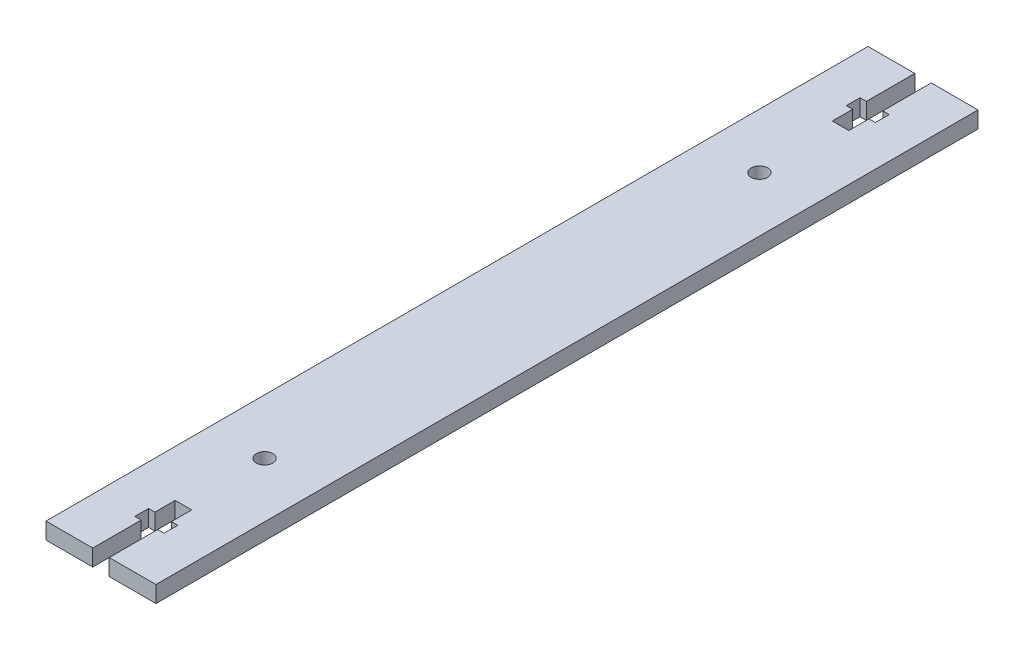
ISO-10303-21;
HEADER;
FILE_DESCRIPTION(('STEP AP214'),'2;1');
FILE_NAME('part.step','',(''),(''),'','','');
FILE_SCHEMA(('AUTOMOTIVE_DESIGN { 1 0 10303 214 1 1 1 1 }'));
ENDSEC;
DATA;
#1=APPLICATION_CONTEXT('core data for automotive mechanical design processes');
#2=APPLICATION_PROTOCOL_DEFINITION('international standard','automotive_design',2000,#1);
#3=PRODUCT_CONTEXT('',#1,'mechanical');
#4=PRODUCT('Part','Part','',(#3));
#5=PRODUCT_RELATED_PRODUCT_CATEGORY('part','',(#4));
#6=PRODUCT_DEFINITION_FORMATION('','',#4);
#7=PRODUCT_DEFINITION_CONTEXT('part definition',#1,'design');
#8=PRODUCT_DEFINITION('design','',#6,#7);
#9=PRODUCT_DEFINITION_SHAPE('','',#8);
#10=(LENGTH_UNIT() NAMED_UNIT(*) SI_UNIT(.MILLI.,.METRE.));
#11=(NAMED_UNIT(*) PLANE_ANGLE_UNIT() SI_UNIT($,.RADIAN.));
#12=(NAMED_UNIT(*) SI_UNIT($,.STERADIAN.) SOLID_ANGLE_UNIT());
#13=UNCERTAINTY_MEASURE_WITH_UNIT(LENGTH_MEASURE(1.E-05),#10,'distance_accuracy_value','');
#14=(GEOMETRIC_REPRESENTATION_CONTEXT(3) GLOBAL_UNCERTAINTY_ASSIGNED_CONTEXT((#13)) GLOBAL_UNIT_ASSIGNED_CONTEXT((#10,
#11,#12)) REPRESENTATION_CONTEXT('',''));
#15=CARTESIAN_POINT('',(0.,0.,0.));
#16=DIRECTION('',(0.,0.,1.));
#17=DIRECTION('',(1.,0.,0.));
#18=AXIS2_PLACEMENT_3D('',#15,#16,#17);
#19=CARTESIAN_POINT('',(-20.,3.,299.));
#20=DIRECTION('',(0.,-1.,0.));
#21=DIRECTION('',(0.,0.,-1.));
#22=AXIS2_PLACEMENT_3D('',#19,#20,#21);
#23=PLANE('',#22);
#24=CARTESIAN_POINT('',(0.,3.,59.5));
#25=DIRECTION('',(0.,-1.,0.));
#26=DIRECTION('',(0.,0.,-1.));
#27=AXIS2_PLACEMENT_3D('',#24,#25,#26);
#28=CIRCLE('',#27,3.);
#29=CARTESIAN_POINT('',(0.,3.,56.5));
#30=VERTEX_POINT('',#29);
#31=EDGE_CURVE('E369',#30,#30,#28,.T.);
#32=ORIENTED_EDGE('',*,*,#31,.T.);
#33=EDGE_LOOP('',(#32));
#34=FACE_BOUND('',#33,.T.);
#35=CARTESIAN_POINT('',(0.,3.,239.5));
#36=DIRECTION('',(0.,-1.,0.));
#37=DIRECTION('',(0.,0.,-1.));
#38=AXIS2_PLACEMENT_3D('',#35,#36,#37);
#39=CIRCLE('',#38,3.);
#40=CARTESIAN_POINT('',(0.,3.,236.5));
#41=VERTEX_POINT('',#40);
#42=EDGE_CURVE('E373',#41,#41,#39,.T.);
#43=ORIENTED_EDGE('',*,*,#42,.T.);
#44=EDGE_LOOP('',(#43));
#45=FACE_BOUND('',#44,.T.);
#46=DIRECTION('',(0.,0.,1.));
#47=VECTOR('',#46,1.);
#48=CARTESIAN_POINT('',(-3.00000000000004,3.,299.));
#49=LINE('',#48,#47);
#50=CARTESIAN_POINT('',(-3.,3.,0.));
#51=VERTEX_POINT('',#50);
#52=CARTESIAN_POINT('',(-3.,3.,17.6135721451776));
#53=VERTEX_POINT('',#52);
#54=EDGE_CURVE('E281',#51,#53,#49,.T.);
#55=ORIENTED_EDGE('',*,*,#54,.F.);
#56=DIRECTION('',(-1.,0.,0.));
#57=VECTOR('',#56,1.);
#58=CARTESIAN_POINT('',(-20.,3.,0.));
#59=LINE('',#58,#57);
#60=CARTESIAN_POINT('',(-20.,3.,0.));
#61=VERTEX_POINT('',#60);
#62=EDGE_CURVE('E393',#51,#61,#59,.T.);
#63=ORIENTED_EDGE('',*,*,#62,.T.);
#64=DIRECTION('',(0.,0.,-1.));
#65=VECTOR('',#64,1.);
#66=CARTESIAN_POINT('',(-20.,3.,299.));
#67=LINE('',#66,#65);
#68=CARTESIAN_POINT('',(-20.,3.,299.));
#69=VERTEX_POINT('',#68);
#70=EDGE_CURVE('E405',#69,#61,#67,.T.);
#71=ORIENTED_EDGE('',*,*,#70,.F.);
#72=DIRECTION('',(-1.,0.,0.));
#73=VECTOR('',#72,1.);
#74=CARTESIAN_POINT('',(-20.,3.,299.));
#75=LINE('',#74,#73);
#76=CARTESIAN_POINT('',(-3.,3.,299.));
#77=VERTEX_POINT('',#76);
#78=EDGE_CURVE('E380',#77,#69,#75,.T.);
#79=ORIENTED_EDGE('',*,*,#78,.F.);
#80=DIRECTION('',(0.,0.,-1.));
#81=VECTOR('',#80,1.);
#82=CARTESIAN_POINT('',(-3.,3.,299.));
#83=LINE('',#82,#81);
#84=CARTESIAN_POINT('',(-3.,3.,281.386427854822));
#85=VERTEX_POINT('',#84);
#86=EDGE_CURVE('E61',#77,#85,#83,.T.);
#87=ORIENTED_EDGE('',*,*,#86,.T.);
#88=DIRECTION('',(-1.,0.,0.));
#89=VECTOR('',#88,1.);
#90=CARTESIAN_POINT('',(-20.,3.,281.386427854822));
#91=LINE('',#90,#89);
#92=CARTESIAN_POINT('',(-5.311461505817,3.,281.386427854822));
#93=VERTEX_POINT('',#92);
#94=EDGE_CURVE('E347',#85,#93,#91,.T.);
#95=ORIENTED_EDGE('',*,*,#94,.T.);
#96=DIRECTION('',(0.,0.,-1.));
#97=VECTOR('',#96,1.);
#98=CARTESIAN_POINT('',(-5.311461505817,3.,299.));
#99=LINE('',#98,#97);
#100=CARTESIAN_POINT('',(-5.311461505817,3.,276.386427854822));
#101=VERTEX_POINT('',#100);
#102=EDGE_CURVE('E344',#93,#101,#99,.T.);
#103=ORIENTED_EDGE('',*,*,#102,.T.);
#104=DIRECTION('',(1.,0.,0.));
#105=VECTOR('',#104,1.);
#106=CARTESIAN_POINT('',(-20.,3.,276.386427854822));
#107=LINE('',#106,#105);
#108=CARTESIAN_POINT('',(-3.,3.,276.386427854822));
#109=VERTEX_POINT('',#108);
#110=EDGE_CURVE('E341',#101,#109,#107,.T.);
#111=ORIENTED_EDGE('',*,*,#110,.T.);
#112=DIRECTION('',(0.,0.,-1.));
#113=VECTOR('',#112,1.);
#114=CARTESIAN_POINT('',(-3.,3.,299.));
#115=LINE('',#114,#113);
#116=CARTESIAN_POINT('',(-3.,3.,269.));
#117=VERTEX_POINT('',#116);
#118=EDGE_CURVE('E365',#109,#117,#115,.T.);
#119=ORIENTED_EDGE('',*,*,#118,.T.);
#120=DIRECTION('',(1.,0.,0.));
#121=VECTOR('',#120,1.);
#122=CARTESIAN_POINT('',(-20.,3.,269.));
#123=LINE('',#122,#121);
#124=CARTESIAN_POINT('',(3.,3.,269.));
#125=VERTEX_POINT('',#124);
#126=EDGE_CURVE('E362',#117,#125,#123,.T.);
#127=ORIENTED_EDGE('',*,*,#126,.T.);
#128=DIRECTION('',(0.,0.,1.));
#129=VECTOR('',#128,1.);
#130=CARTESIAN_POINT('',(2.99999999999998,3.,299.));
#131=LINE('',#130,#129);
#132=CARTESIAN_POINT('',(2.99999999999999,3.,276.386427854822));
#133=VERTEX_POINT('',#132);
#134=EDGE_CURVE('E359',#125,#133,#131,.T.);
#135=ORIENTED_EDGE('',*,*,#134,.T.);
#136=DIRECTION('',(1.,0.,0.));
#137=VECTOR('',#136,1.);
#138=CARTESIAN_POINT('',(-20.,3.,276.386427854822));
#139=LINE('',#138,#137);
#140=CARTESIAN_POINT('',(5.311461505817,3.,276.386427854822));
#141=VERTEX_POINT('',#140);
#142=EDGE_CURVE('E356',#133,#141,#139,.T.);
#143=ORIENTED_EDGE('',*,*,#142,.T.);
#144=DIRECTION('',(0.,0.,1.));
#145=VECTOR('',#144,1.);
#146=CARTESIAN_POINT('',(5.311461505817,3.,299.));
#147=LINE('',#146,#145);
#148=CARTESIAN_POINT('',(5.311461505817,3.,281.386427854822));
#149=VERTEX_POINT('',#148);
#150=EDGE_CURVE('E353',#141,#149,#147,.T.);
#151=ORIENTED_EDGE('',*,*,#150,.T.);
#152=DIRECTION('',(-1.,0.,0.));
#153=VECTOR('',#152,1.);
#154=CARTESIAN_POINT('',(-20.,3.,281.386427854822));
#155=LINE('',#154,#153);
#156=CARTESIAN_POINT('',(3.,3.,281.386427854822));
#157=VERTEX_POINT('',#156);
#158=EDGE_CURVE('E350',#149,#157,#155,.T.);
#159=ORIENTED_EDGE('',*,*,#158,.T.);
#160=DIRECTION('',(0.,0.,1.));
#161=VECTOR('',#160,1.);
#162=CARTESIAN_POINT('',(3.,3.,299.));
#163=LINE('',#162,#161);
#164=CARTESIAN_POINT('',(3.,3.,299.));
#165=VERTEX_POINT('',#164);
#166=EDGE_CURVE('E338',#157,#165,#163,.T.);
#167=ORIENTED_EDGE('',*,*,#166,.T.);
#168=CARTESIAN_POINT('',(20.,3.,299.));
#169=VERTEX_POINT('',#168);
#170=EDGE_CURVE('E381',#169,#165,#75,.T.);
#171=ORIENTED_EDGE('',*,*,#170,.F.);
#172=DIRECTION('',(0.,0.,-1.));
#173=VECTOR('',#172,1.);
#174=CARTESIAN_POINT('',(20.,3.,299.));
#175=LINE('',#174,#173);
#176=CARTESIAN_POINT('',(20.,3.,0.));
#177=VERTEX_POINT('',#176);
#178=EDGE_CURVE('E408',#169,#177,#175,.T.);
#179=ORIENTED_EDGE('',*,*,#178,.T.);
#180=CARTESIAN_POINT('',(3.,3.,0.));
#181=VERTEX_POINT('',#180);
#182=EDGE_CURVE('E394',#177,#181,#59,.T.);
#183=ORIENTED_EDGE('',*,*,#182,.T.);
#184=DIRECTION('',(0.,0.,-1.));
#185=VECTOR('',#184,1.);
#186=CARTESIAN_POINT('',(3.00000000000003,3.,299.));
#187=LINE('',#186,#185);
#188=CARTESIAN_POINT('',(3.,3.,17.6135721451776));
#189=VERTEX_POINT('',#188);
#190=EDGE_CURVE('E53',#189,#181,#187,.T.);
#191=ORIENTED_EDGE('',*,*,#190,.F.);
#192=DIRECTION('',(-1.,0.,0.));
#193=VECTOR('',#192,1.);
#194=CARTESIAN_POINT('',(-20.,3.,17.6135721451776));
#195=LINE('',#194,#193);
#196=CARTESIAN_POINT('',(5.311461505817,3.,17.6135721451776));
#197=VERTEX_POINT('',#196);
#198=EDGE_CURVE('E238',#197,#189,#195,.T.);
#199=ORIENTED_EDGE('',*,*,#198,.F.);
#200=DIRECTION('',(0.,0.,-1.));
#201=VECTOR('',#200,1.);
#202=CARTESIAN_POINT('',(5.311461505817,3.,299.));
#203=LINE('',#202,#201);
#204=CARTESIAN_POINT('',(5.311461505817,3.,22.6135721451776));
#205=VERTEX_POINT('',#204);
#206=EDGE_CURVE('E292',#205,#197,#203,.T.);
#207=ORIENTED_EDGE('',*,*,#206,.F.);
#208=DIRECTION('',(1.,0.,0.));
#209=VECTOR('',#208,1.);
#210=CARTESIAN_POINT('',(-20.,3.,22.6135721451776));
#211=LINE('',#210,#209);
#212=CARTESIAN_POINT('',(2.99999999999999,3.,22.6135721451776));
#213=VERTEX_POINT('',#212);
#214=EDGE_CURVE('E290',#213,#205,#211,.T.);
#215=ORIENTED_EDGE('',*,*,#214,.F.);
#216=DIRECTION('',(0.,0.,-1.));
#217=VECTOR('',#216,1.);
#218=CARTESIAN_POINT('',(3.00000000000022,3.,299.));
#219=LINE('',#218,#217);
#220=CARTESIAN_POINT('',(3.,3.,30.));
#221=VERTEX_POINT('',#220);
#222=EDGE_CURVE('E288',#221,#213,#219,.T.);
#223=ORIENTED_EDGE('',*,*,#222,.F.);
#224=DIRECTION('',(1.,0.,0.));
#225=VECTOR('',#224,1.);
#226=CARTESIAN_POINT('',(-20.,3.,30.));
#227=LINE('',#226,#225);
#228=CARTESIAN_POINT('',(-3.,3.,30.));
#229=VERTEX_POINT('',#228);
#230=EDGE_CURVE('E283',#229,#221,#227,.T.);
#231=ORIENTED_EDGE('',*,*,#230,.F.);
#232=DIRECTION('',(0.,0.,1.));
#233=VECTOR('',#232,1.);
#234=CARTESIAN_POINT('',(-3.,3.,299.));
#235=LINE('',#234,#233);
#236=CARTESIAN_POINT('',(-3.,3.,22.6135721451776));
#237=VERTEX_POINT('',#236);
#238=EDGE_CURVE('E300',#237,#229,#235,.T.);
#239=ORIENTED_EDGE('',*,*,#238,.F.);
#240=DIRECTION('',(1.,0.,0.));
#241=VECTOR('',#240,1.);
#242=CARTESIAN_POINT('',(-20.,3.,22.6135721451776));
#243=LINE('',#242,#241);
#244=CARTESIAN_POINT('',(-5.311461505817,3.,22.6135721451776));
#245=VERTEX_POINT('',#244);
#246=EDGE_CURVE('E298',#245,#237,#243,.T.);
#247=ORIENTED_EDGE('',*,*,#246,.F.);
#248=DIRECTION('',(0.,0.,1.));
#249=VECTOR('',#248,1.);
#250=CARTESIAN_POINT('',(-5.311461505817,3.,299.));
#251=LINE('',#250,#249);
#252=CARTESIAN_POINT('',(-5.311461505817,3.,17.6135721451776));
#253=VERTEX_POINT('',#252);
#254=EDGE_CURVE('E296',#253,#245,#251,.T.);
#255=ORIENTED_EDGE('',*,*,#254,.F.);
#256=DIRECTION('',(-1.,0.,0.));
#257=VECTOR('',#256,1.);
#258=CARTESIAN_POINT('',(-20.,3.,17.6135721451776));
#259=LINE('',#258,#257);
#260=EDGE_CURVE('E272',#53,#253,#259,.T.);
#261=ORIENTED_EDGE('',*,*,#260,.F.);
#262=EDGE_LOOP('',(#55,#63,#71,#79,#87,#95,#103,#111,#119,#127,#135,#143,#151,#159,#167,#171,
#179,#183,#191,#199,#207,#215,#223,#231,#239,#247,#255,#261));
#263=FACE_BOUND('',#262,.T.);
#264=ADVANCED_FACE('F38',(#34,#45,#263),#23,.F.);
#265=CARTESIAN_POINT('',(-20.,-3.,299.));
#266=DIRECTION('',(0.,1.,0.));
#267=DIRECTION('',(0.,0.,1.));
#268=AXIS2_PLACEMENT_3D('',#265,#266,#267);
#269=PLANE('',#268);
#270=CARTESIAN_POINT('',(0.,-3.,59.5));
#271=DIRECTION('',(0.,1.,0.));
#272=DIRECTION('',(0.,0.,1.));
#273=AXIS2_PLACEMENT_3D('',#270,#271,#272);
#274=CIRCLE('',#273,3.);
#275=CARTESIAN_POINT('',(0.,-3.,62.5));
#276=VERTEX_POINT('',#275);
#277=EDGE_CURVE('E368',#276,#276,#274,.T.);
#278=ORIENTED_EDGE('',*,*,#277,.T.);
#279=EDGE_LOOP('',(#278));
#280=FACE_BOUND('',#279,.T.);
#281=CARTESIAN_POINT('',(0.,-3.,239.5));
#282=DIRECTION('',(0.,1.,0.));
#283=DIRECTION('',(0.,0.,1.));
#284=AXIS2_PLACEMENT_3D('',#281,#282,#283);
#285=CIRCLE('',#284,3.);
#286=CARTESIAN_POINT('',(0.,-3.,242.5));
#287=VERTEX_POINT('',#286);
#288=EDGE_CURVE('E372',#287,#287,#285,.T.);
#289=ORIENTED_EDGE('',*,*,#288,.T.);
#290=EDGE_LOOP('',(#289));
#291=FACE_BOUND('',#290,.T.);
#292=DIRECTION('',(0.,0.,-1.));
#293=VECTOR('',#292,1.);
#294=CARTESIAN_POINT('',(-3.00000000000004,-3.,299.));
#295=LINE('',#294,#293);
#296=CARTESIAN_POINT('',(-3.,-3.,17.6135721451776));
#297=VERTEX_POINT('',#296);
#298=CARTESIAN_POINT('',(-3.,-3.,0.));
#299=VERTEX_POINT('',#298);
#300=EDGE_CURVE('E275',#297,#299,#295,.T.);
#301=ORIENTED_EDGE('',*,*,#300,.F.);
#302=DIRECTION('',(1.,0.,0.));
#303=VECTOR('',#302,1.);
#304=CARTESIAN_POINT('',(-20.,-3.,17.6135721451776));
#305=LINE('',#304,#303);
#306=CARTESIAN_POINT('',(-5.311461505817,-3.,17.6135721451776));
#307=VERTEX_POINT('',#306);
#308=EDGE_CURVE('E11',#307,#297,#305,.T.);
#309=ORIENTED_EDGE('',*,*,#308,.F.);
#310=DIRECTION('',(0.,0.,-1.));
#311=VECTOR('',#310,1.);
#312=CARTESIAN_POINT('',(-5.311461505817,-3.,299.));
#313=LINE('',#312,#311);
#314=CARTESIAN_POINT('',(-5.311461505817,-3.,22.6135721451776));
#315=VERTEX_POINT('',#314);
#316=EDGE_CURVE('E46',#315,#307,#313,.T.);
#317=ORIENTED_EDGE('',*,*,#316,.F.);
#318=DIRECTION('',(-1.,0.,0.));
#319=VECTOR('',#318,1.);
#320=CARTESIAN_POINT('',(-20.,-3.,22.6135721451776));
#321=LINE('',#320,#319);
#322=CARTESIAN_POINT('',(-3.,-3.,22.6135721451776));
#323=VERTEX_POINT('',#322);
#324=EDGE_CURVE('E249',#323,#315,#321,.T.);
#325=ORIENTED_EDGE('',*,*,#324,.F.);
#326=DIRECTION('',(0.,0.,-1.));
#327=VECTOR('',#326,1.);
#328=CARTESIAN_POINT('',(-3.,-3.,299.));
#329=LINE('',#328,#327);
#330=CARTESIAN_POINT('',(-3.,-3.,30.));
#331=VERTEX_POINT('',#330);
#332=EDGE_CURVE('E247',#331,#323,#329,.T.);
#333=ORIENTED_EDGE('',*,*,#332,.F.);
#334=DIRECTION('',(-1.,0.,0.));
#335=VECTOR('',#334,1.);
#336=CARTESIAN_POINT('',(-20.,-3.,30.));
#337=LINE('',#336,#335);
#338=CARTESIAN_POINT('',(3.,-3.,30.));
#339=VERTEX_POINT('',#338);
#340=EDGE_CURVE('E450',#339,#331,#337,.T.);
#341=ORIENTED_EDGE('',*,*,#340,.F.);
#342=DIRECTION('',(0.,0.,1.));
#343=VECTOR('',#342,1.);
#344=CARTESIAN_POINT('',(3.00000000000022,-3.,299.));
#345=LINE('',#344,#343);
#346=CARTESIAN_POINT('',(2.99999999999999,-3.,22.6135721451776));
#347=VERTEX_POINT('',#346);
#348=EDGE_CURVE('E452',#347,#339,#345,.T.);
#349=ORIENTED_EDGE('',*,*,#348,.F.);
#350=DIRECTION('',(-1.,0.,0.));
#351=VECTOR('',#350,1.);
#352=CARTESIAN_POINT('',(-20.,-3.,22.6135721451776));
#353=LINE('',#352,#351);
#354=CARTESIAN_POINT('',(5.311461505817,-3.,22.6135721451776));
#355=VERTEX_POINT('',#354);
#356=EDGE_CURVE('E251',#355,#347,#353,.T.);
#357=ORIENTED_EDGE('',*,*,#356,.F.);
#358=DIRECTION('',(0.,0.,1.));
#359=VECTOR('',#358,1.);
#360=CARTESIAN_POINT('',(5.311461505817,-3.,299.));
#361=LINE('',#360,#359);
#362=CARTESIAN_POINT('',(5.311461505817,-3.,17.6135721451776));
#363=VERTEX_POINT('',#362);
#364=EDGE_CURVE('E246',#363,#355,#361,.T.);
#365=ORIENTED_EDGE('',*,*,#364,.F.);
#366=DIRECTION('',(1.,0.,0.));
#367=VECTOR('',#366,1.);
#368=CARTESIAN_POINT('',(-20.,-3.,17.6135721451776));
#369=LINE('',#368,#367);
#370=CARTESIAN_POINT('',(3.,-3.,17.6135721451776));
#371=VERTEX_POINT('',#370);
#372=EDGE_CURVE('E235',#371,#363,#369,.T.);
#373=ORIENTED_EDGE('',*,*,#372,.F.);
#374=DIRECTION('',(0.,0.,1.));
#375=VECTOR('',#374,1.);
#376=CARTESIAN_POINT('',(3.00000000000003,-3.,299.));
#377=LINE('',#376,#375);
#378=CARTESIAN_POINT('',(3.,-3.,0.));
#379=VERTEX_POINT('',#378);
#380=EDGE_CURVE('E222',#379,#371,#377,.T.);
#381=ORIENTED_EDGE('',*,*,#380,.F.);
#382=DIRECTION('',(1.,0.,0.));
#383=VECTOR('',#382,1.);
#384=CARTESIAN_POINT('',(-20.,-3.,0.));
#385=LINE('',#384,#383);
#386=CARTESIAN_POINT('',(20.,-3.,0.));
#387=VERTEX_POINT('',#386);
#388=EDGE_CURVE('E399',#379,#387,#385,.T.);
#389=ORIENTED_EDGE('',*,*,#388,.T.);
#390=DIRECTION('',(0.,0.,-1.));
#391=VECTOR('',#390,1.);
#392=CARTESIAN_POINT('',(20.,-3.,299.));
#393=LINE('',#392,#391);
#394=CARTESIAN_POINT('',(20.,-3.,299.));
#395=VERTEX_POINT('',#394);
#396=EDGE_CURVE('E390',#395,#387,#393,.T.);
#397=ORIENTED_EDGE('',*,*,#396,.F.);
#398=DIRECTION('',(1.,0.,0.));
#399=VECTOR('',#398,1.);
#400=CARTESIAN_POINT('',(-20.,-3.,299.));
#401=LINE('',#400,#399);
#402=CARTESIAN_POINT('',(3.,-3.,299.));
#403=VERTEX_POINT('',#402);
#404=EDGE_CURVE('E386',#403,#395,#401,.T.);
#405=ORIENTED_EDGE('',*,*,#404,.F.);
#406=DIRECTION('',(0.,0.,-1.));
#407=VECTOR('',#406,1.);
#408=CARTESIAN_POINT('',(3.,-3.,299.));
#409=LINE('',#408,#407);
#410=CARTESIAN_POINT('',(3.,-3.,281.386427854822));
#411=VERTEX_POINT('',#410);
#412=EDGE_CURVE('E335',#403,#411,#409,.T.);
#413=ORIENTED_EDGE('',*,*,#412,.T.);
#414=DIRECTION('',(1.,0.,0.));
#415=VECTOR('',#414,1.);
#416=CARTESIAN_POINT('',(-20.,-3.,281.386427854822));
#417=LINE('',#416,#415);
#418=CARTESIAN_POINT('',(5.311461505817,-3.,281.386427854822));
#419=VERTEX_POINT('',#418);
#420=EDGE_CURVE('E444',#411,#419,#417,.T.);
#421=ORIENTED_EDGE('',*,*,#420,.T.);
#422=DIRECTION('',(0.,0.,-1.));
#423=VECTOR('',#422,1.);
#424=CARTESIAN_POINT('',(5.311461505817,-3.,299.));
#425=LINE('',#424,#423);
#426=CARTESIAN_POINT('',(5.311461505817,-3.,276.386427854822));
#427=VERTEX_POINT('',#426);
#428=EDGE_CURVE('E441',#419,#427,#425,.T.);
#429=ORIENTED_EDGE('',*,*,#428,.T.);
#430=DIRECTION('',(-1.,0.,0.));
#431=VECTOR('',#430,1.);
#432=CARTESIAN_POINT('',(-20.,-3.,276.386427854822));
#433=LINE('',#432,#431);
#434=CARTESIAN_POINT('',(2.99999999999999,-3.,276.386427854822));
#435=VERTEX_POINT('',#434);
#436=EDGE_CURVE('E438',#427,#435,#433,.T.);
#437=ORIENTED_EDGE('',*,*,#436,.T.);
#438=DIRECTION('',(0.,0.,-1.));
#439=VECTOR('',#438,1.);
#440=CARTESIAN_POINT('',(2.99999999999998,-3.,299.));
#441=LINE('',#440,#439);
#442=CARTESIAN_POINT('',(3.,-3.,269.));
#443=VERTEX_POINT('',#442);
#444=EDGE_CURVE('E435',#435,#443,#441,.T.);
#445=ORIENTED_EDGE('',*,*,#444,.T.);
#446=DIRECTION('',(-1.,0.,0.));
#447=VECTOR('',#446,1.);
#448=CARTESIAN_POINT('',(-20.,-3.,269.));
#449=LINE('',#448,#447);
#450=CARTESIAN_POINT('',(-3.,-3.,269.));
#451=VERTEX_POINT('',#450);
#452=EDGE_CURVE('E432',#443,#451,#449,.T.);
#453=ORIENTED_EDGE('',*,*,#452,.T.);
#454=DIRECTION('',(0.,0.,1.));
#455=VECTOR('',#454,1.);
#456=CARTESIAN_POINT('',(-3.,-3.,299.));
#457=LINE('',#456,#455);
#458=CARTESIAN_POINT('',(-3.,-3.,276.386427854822));
#459=VERTEX_POINT('',#458);
#460=EDGE_CURVE('E429',#451,#459,#457,.T.);
#461=ORIENTED_EDGE('',*,*,#460,.T.);
#462=DIRECTION('',(-1.,0.,0.));
#463=VECTOR('',#462,1.);
#464=CARTESIAN_POINT('',(-20.,-3.,276.386427854822));
#465=LINE('',#464,#463);
#466=CARTESIAN_POINT('',(-5.311461505817,-3.,276.386427854822));
#467=VERTEX_POINT('',#466);
#468=EDGE_CURVE('E420',#459,#467,#465,.T.);
#469=ORIENTED_EDGE('',*,*,#468,.T.);
#470=DIRECTION('',(0.,0.,1.));
#471=VECTOR('',#470,1.);
#472=CARTESIAN_POINT('',(-5.311461505817,-3.,299.));
#473=LINE('',#472,#471);
#474=CARTESIAN_POINT('',(-5.311461505817,-3.,281.386427854822));
#475=VERTEX_POINT('',#474);
#476=EDGE_CURVE('E423',#467,#475,#473,.T.);
#477=ORIENTED_EDGE('',*,*,#476,.T.);
#478=DIRECTION('',(1.,0.,0.));
#479=VECTOR('',#478,1.);
#480=CARTESIAN_POINT('',(-20.,-3.,281.386427854822));
#481=LINE('',#480,#479);
#482=CARTESIAN_POINT('',(-3.,-3.,281.386427854822));
#483=VERTEX_POINT('',#482);
#484=EDGE_CURVE('E426',#475,#483,#481,.T.);
#485=ORIENTED_EDGE('',*,*,#484,.T.);
#486=DIRECTION('',(0.,0.,1.));
#487=VECTOR('',#486,1.);
#488=CARTESIAN_POINT('',(-3.,-3.,299.));
#489=LINE('',#488,#487);
#490=CARTESIAN_POINT('',(-3.,-3.,299.));
#491=VERTEX_POINT('',#490);
#492=EDGE_CURVE('E306',#483,#491,#489,.T.);
#493=ORIENTED_EDGE('',*,*,#492,.T.);
#494=CARTESIAN_POINT('',(-20.,-3.,299.));
#495=VERTEX_POINT('',#494);
#496=EDGE_CURVE('E387',#495,#491,#401,.T.);
#497=ORIENTED_EDGE('',*,*,#496,.F.);
#498=DIRECTION('',(0.,0.,-1.));
#499=VECTOR('',#498,1.);
#500=CARTESIAN_POINT('',(-20.,-3.,299.));
#501=LINE('',#500,#499);
#502=CARTESIAN_POINT('',(-20.,-3.,0.));
#503=VERTEX_POINT('',#502);
#504=EDGE_CURVE('E403',#495,#503,#501,.T.);
#505=ORIENTED_EDGE('',*,*,#504,.T.);
#506=EDGE_CURVE('E278',#503,#299,#385,.T.);
#507=ORIENTED_EDGE('',*,*,#506,.T.);
#508=EDGE_LOOP('',(#301,#309,#317,#325,#333,#341,#349,#357,#365,#373,#381,#389,#397,#405,#413,
#421,#429,#437,#445,#453,#461,#469,#477,#485,#493,#497,#505,#507));
#509=FACE_BOUND('',#508,.T.);
#510=ADVANCED_FACE('F244',(#280,#291,#509),#269,.F.);
#511=CARTESIAN_POINT('',(0.,0.,0.));
#512=DIRECTION('',(0.,0.,-1.));
#513=DIRECTION('',(-1.,0.,0.));
#514=AXIS2_PLACEMENT_3D('',#511,#512,#513);
#515=PLANE('',#514);
#516=ORIENTED_EDGE('',*,*,#62,.F.);
#517=DIRECTION('',(0.,-1.,0.));
#518=VECTOR('',#517,1.);
#519=CARTESIAN_POINT('',(-3.,0.,0.));
#520=LINE('',#519,#518);
#521=EDGE_CURVE('E448',#51,#299,#520,.T.);
#522=ORIENTED_EDGE('',*,*,#521,.T.);
#523=ORIENTED_EDGE('',*,*,#506,.F.);
#524=DIRECTION('',(0.,-1.,0.));
#525=VECTOR('',#524,1.);
#526=CARTESIAN_POINT('',(-20.,-3.,0.));
#527=LINE('',#526,#525);
#528=EDGE_CURVE('E397',#61,#503,#527,.T.);
#529=ORIENTED_EDGE('',*,*,#528,.F.);
#530=EDGE_LOOP('',(#516,#522,#523,#529));
#531=FACE_BOUND('',#530,.T.);
#532=ADVANCED_FACE('F549',(#531),#515,.T.);
#533=ORIENTED_EDGE('',*,*,#388,.F.);
#534=DIRECTION('',(0.,1.,0.));
#535=VECTOR('',#534,1.);
#536=CARTESIAN_POINT('',(3.,0.,0.));
#537=LINE('',#536,#535);
#538=EDGE_CURVE('E226',#379,#181,#537,.T.);
#539=ORIENTED_EDGE('',*,*,#538,.T.);
#540=ORIENTED_EDGE('',*,*,#182,.F.);
#541=DIRECTION('',(0.,1.,0.));
#542=VECTOR('',#541,1.);
#543=CARTESIAN_POINT('',(20.,-3.,0.));
#544=LINE('',#543,#542);
#545=EDGE_CURVE('E376',#387,#177,#544,.T.);
#546=ORIENTED_EDGE('',*,*,#545,.F.);
#547=EDGE_LOOP('',(#533,#539,#540,#546));
#548=FACE_BOUND('',#547,.T.);
#549=ADVANCED_FACE('F500',(#548),#515,.T.);
#550=CARTESIAN_POINT('',(0.,0.,299.));
#551=DIRECTION('',(0.,0.,-1.));
#552=DIRECTION('',(-1.,0.,0.));
#553=AXIS2_PLACEMENT_3D('',#550,#551,#552);
#554=PLANE('',#553);
#555=ORIENTED_EDGE('',*,*,#170,.T.);
#556=DIRECTION('',(0.,-1.,0.));
#557=VECTOR('',#556,1.);
#558=CARTESIAN_POINT('',(3.,0.,299.));
#559=LINE('',#558,#557);
#560=EDGE_CURVE('E417',#165,#403,#559,.T.);
#561=ORIENTED_EDGE('',*,*,#560,.T.);
#562=ORIENTED_EDGE('',*,*,#404,.T.);
#563=DIRECTION('',(0.,1.,0.));
#564=VECTOR('',#563,1.);
#565=CARTESIAN_POINT('',(20.,-3.,299.));
#566=LINE('',#565,#564);
#567=EDGE_CURVE('E377',#395,#169,#566,.T.);
#568=ORIENTED_EDGE('',*,*,#567,.T.);
#569=EDGE_LOOP('',(#555,#561,#562,#568));
#570=FACE_BOUND('',#569,.T.);
#571=ADVANCED_FACE('F506',(#570),#554,.F.);
#572=CARTESIAN_POINT('',(20.,-3.,299.));
#573=DIRECTION('',(-1.,0.,0.));
#574=DIRECTION('',(0.,0.,1.));
#575=AXIS2_PLACEMENT_3D('',#572,#573,#574);
#576=PLANE('',#575);
#577=ORIENTED_EDGE('',*,*,#545,.T.);
#578=ORIENTED_EDGE('',*,*,#178,.F.);
#579=ORIENTED_EDGE('',*,*,#567,.F.);
#580=ORIENTED_EDGE('',*,*,#396,.T.);
#581=EDGE_LOOP('',(#577,#578,#579,#580));
#582=FACE_BOUND('',#581,.T.);
#583=ADVANCED_FACE('F40',(#582),#576,.F.);
#584=CARTESIAN_POINT('',(-20.,-3.,299.));
#585=DIRECTION('',(1.,0.,0.));
#586=DIRECTION('',(0.,0.,-1.));
#587=AXIS2_PLACEMENT_3D('',#584,#585,#586);
#588=PLANE('',#587);
#589=ORIENTED_EDGE('',*,*,#528,.T.);
#590=ORIENTED_EDGE('',*,*,#504,.F.);
#591=DIRECTION('',(0.,-1.,0.));
#592=VECTOR('',#591,1.);
#593=CARTESIAN_POINT('',(-20.,-3.,299.));
#594=LINE('',#593,#592);
#595=EDGE_CURVE('E384',#69,#495,#594,.T.);
#596=ORIENTED_EDGE('',*,*,#595,.F.);
#597=ORIENTED_EDGE('',*,*,#70,.T.);
#598=EDGE_LOOP('',(#589,#590,#596,#597));
#599=FACE_BOUND('',#598,.T.);
#600=ADVANCED_FACE('F569',(#599),#588,.F.);
#601=ORIENTED_EDGE('',*,*,#496,.T.);
#602=DIRECTION('',(0.,1.,0.));
#603=VECTOR('',#602,1.);
#604=CARTESIAN_POINT('',(-3.,0.,299.));
#605=LINE('',#604,#603);
#606=EDGE_CURVE('E411',#491,#77,#605,.T.);
#607=ORIENTED_EDGE('',*,*,#606,.T.);
#608=ORIENTED_EDGE('',*,*,#78,.T.);
#609=ORIENTED_EDGE('',*,*,#595,.T.);
#610=EDGE_LOOP('',(#601,#607,#608,#609));
#611=FACE_BOUND('',#610,.T.);
#612=ADVANCED_FACE('F541',(#611),#554,.F.);
#613=CARTESIAN_POINT('',(0.,-39.,59.5));
#614=DIRECTION('',(0.,1.,0.));
#615=DIRECTION('',(0.,0.,1.));
#616=AXIS2_PLACEMENT_3D('',#613,#614,#615);
#617=CYLINDRICAL_SURFACE('',#616,3.);
#618=ORIENTED_EDGE('',*,*,#277,.F.);
#619=EDGE_LOOP('',(#618));
#620=FACE_BOUND('',#619,.T.);
#621=ORIENTED_EDGE('',*,*,#31,.F.);
#622=EDGE_LOOP('',(#621));
#623=FACE_BOUND('',#622,.T.);
#624=ADVANCED_FACE('F576',(#620,#623),#617,.F.);
#625=CARTESIAN_POINT('',(0.,-39.,239.5));
#626=DIRECTION('',(0.,1.,0.));
#627=DIRECTION('',(0.,0.,1.));
#628=AXIS2_PLACEMENT_3D('',#625,#626,#627);
#629=CYLINDRICAL_SURFACE('',#628,3.);
#630=ORIENTED_EDGE('',*,*,#288,.F.);
#631=EDGE_LOOP('',(#630));
#632=FACE_BOUND('',#631,.T.);
#633=ORIENTED_EDGE('',*,*,#42,.F.);
#634=EDGE_LOOP('',(#633));
#635=FACE_BOUND('',#634,.T.);
#636=ADVANCED_FACE('F579',(#632,#635),#629,.F.);
#637=CARTESIAN_POINT('',(-3.,-39.,269.));
#638=DIRECTION('',(-1.,0.,0.));
#639=DIRECTION('',(0.,0.,1.));
#640=AXIS2_PLACEMENT_3D('',#637,#638,#639);
#641=PLANE('',#640);
#642=DIRECTION('',(0.,1.,0.));
#643=VECTOR('',#642,1.);
#644=CARTESIAN_POINT('',(-3.,-39.,276.386427854822));
#645=LINE('',#644,#643);
#646=EDGE_CURVE('E302',#459,#109,#645,.T.);
#647=ORIENTED_EDGE('',*,*,#646,.F.);
#648=ORIENTED_EDGE('',*,*,#460,.F.);
#649=DIRECTION('',(0.,1.,0.));
#650=VECTOR('',#649,1.);
#651=CARTESIAN_POINT('',(-3.,-39.,269.));
#652=LINE('',#651,#650);
#653=EDGE_CURVE('E303',#451,#117,#652,.T.);
#654=ORIENTED_EDGE('',*,*,#653,.T.);
#655=ORIENTED_EDGE('',*,*,#118,.F.);
#656=EDGE_LOOP('',(#647,#648,#654,#655));
#657=FACE_BOUND('',#656,.T.);
#658=ADVANCED_FACE('F527',(#657),#641,.F.);
#659=CARTESIAN_POINT('',(3.,-39.,269.));
#660=DIRECTION('',(0.,0.,-1.));
#661=DIRECTION('',(-1.,0.,0.));
#662=AXIS2_PLACEMENT_3D('',#659,#660,#661);
#663=PLANE('',#662);
#664=ORIENTED_EDGE('',*,*,#653,.F.);
#665=ORIENTED_EDGE('',*,*,#452,.F.);
#666=DIRECTION('',(0.,1.,0.));
#667=VECTOR('',#666,1.);
#668=CARTESIAN_POINT('',(3.,-39.,269.));
#669=LINE('',#668,#667);
#670=EDGE_CURVE('E307',#443,#125,#669,.T.);
#671=ORIENTED_EDGE('',*,*,#670,.T.);
#672=ORIENTED_EDGE('',*,*,#126,.F.);
#673=EDGE_LOOP('',(#664,#665,#671,#672));
#674=FACE_BOUND('',#673,.T.);
#675=ADVANCED_FACE('F524',(#674),#663,.F.);
#676=CARTESIAN_POINT('',(2.99999999999999,-39.,276.386427854822));
#677=DIRECTION('',(1.,0.,0.));
#678=DIRECTION('',(0.,0.,-1.));
#679=AXIS2_PLACEMENT_3D('',#676,#677,#678);
#680=PLANE('',#679);
#681=ORIENTED_EDGE('',*,*,#670,.F.);
#682=ORIENTED_EDGE('',*,*,#444,.F.);
#683=DIRECTION('',(0.,1.,0.));
#684=VECTOR('',#683,1.);
#685=CARTESIAN_POINT('',(2.99999999999999,-39.,276.386427854822));
#686=LINE('',#685,#684);
#687=EDGE_CURVE('E310',#435,#133,#686,.T.);
#688=ORIENTED_EDGE('',*,*,#687,.T.);
#689=ORIENTED_EDGE('',*,*,#134,.F.);
#690=EDGE_LOOP('',(#681,#682,#688,#689));
#691=FACE_BOUND('',#690,.T.);
#692=ADVANCED_FACE('F521',(#691),#680,.F.);
#693=CARTESIAN_POINT('',(2.99999999999999,-39.,276.386427854822));
#694=DIRECTION('',(0.,0.,-1.));
#695=DIRECTION('',(-1.,0.,0.));
#696=AXIS2_PLACEMENT_3D('',#693,#694,#695);
#697=PLANE('',#696);
#698=ORIENTED_EDGE('',*,*,#687,.F.);
#699=ORIENTED_EDGE('',*,*,#436,.F.);
#700=DIRECTION('',(0.,1.,0.));
#701=VECTOR('',#700,1.);
#702=CARTESIAN_POINT('',(5.311461505817,-39.,276.386427854822));
#703=LINE('',#702,#701);
#704=EDGE_CURVE('E313',#427,#141,#703,.T.);
#705=ORIENTED_EDGE('',*,*,#704,.T.);
#706=ORIENTED_EDGE('',*,*,#142,.F.);
#707=EDGE_LOOP('',(#698,#699,#705,#706));
#708=FACE_BOUND('',#707,.T.);
#709=ADVANCED_FACE('F518',(#708),#697,.F.);
#710=CARTESIAN_POINT('',(5.311461505817,-39.,281.386427854822));
#711=DIRECTION('',(1.,0.,0.));
#712=DIRECTION('',(0.,0.,-1.));
#713=AXIS2_PLACEMENT_3D('',#710,#711,#712);
#714=PLANE('',#713);
#715=ORIENTED_EDGE('',*,*,#704,.F.);
#716=ORIENTED_EDGE('',*,*,#428,.F.);
#717=DIRECTION('',(0.,1.,0.));
#718=VECTOR('',#717,1.);
#719=CARTESIAN_POINT('',(5.311461505817,-39.,281.386427854822));
#720=LINE('',#719,#718);
#721=EDGE_CURVE('E316',#419,#149,#720,.T.);
#722=ORIENTED_EDGE('',*,*,#721,.T.);
#723=ORIENTED_EDGE('',*,*,#150,.F.);
#724=EDGE_LOOP('',(#715,#716,#722,#723));
#725=FACE_BOUND('',#724,.T.);
#726=ADVANCED_FACE('F515',(#725),#714,.F.);
#727=CARTESIAN_POINT('',(3.,-39.,281.386427854822));
#728=DIRECTION('',(0.,0.,1.));
#729=DIRECTION('',(1.,0.,0.));
#730=AXIS2_PLACEMENT_3D('',#727,#728,#729);
#731=PLANE('',#730);
#732=ORIENTED_EDGE('',*,*,#721,.F.);
#733=ORIENTED_EDGE('',*,*,#420,.F.);
#734=DIRECTION('',(0.,1.,0.));
#735=VECTOR('',#734,1.);
#736=CARTESIAN_POINT('',(3.,-39.,281.386427854822));
#737=LINE('',#736,#735);
#738=EDGE_CURVE('E319',#411,#157,#737,.T.);
#739=ORIENTED_EDGE('',*,*,#738,.T.);
#740=ORIENTED_EDGE('',*,*,#158,.F.);
#741=EDGE_LOOP('',(#732,#733,#739,#740));
#742=FACE_BOUND('',#741,.T.);
#743=ADVANCED_FACE('F512',(#742),#731,.F.);
#744=CARTESIAN_POINT('',(-5.311461505817,-39.,281.386427854822));
#745=DIRECTION('',(0.,0.,1.));
#746=DIRECTION('',(1.,0.,0.));
#747=AXIS2_PLACEMENT_3D('',#744,#745,#746);
#748=PLANE('',#747);
#749=DIRECTION('',(0.,1.,0.));
#750=VECTOR('',#749,1.);
#751=CARTESIAN_POINT('',(-3.,-39.,281.386427854822));
#752=LINE('',#751,#750);
#753=EDGE_CURVE('E322',#483,#85,#752,.T.);
#754=ORIENTED_EDGE('',*,*,#753,.F.);
#755=ORIENTED_EDGE('',*,*,#484,.F.);
#756=DIRECTION('',(0.,1.,0.));
#757=VECTOR('',#756,1.);
#758=CARTESIAN_POINT('',(-5.311461505817,-39.,281.386427854822));
#759=LINE('',#758,#757);
#760=EDGE_CURVE('E324',#475,#93,#759,.T.);
#761=ORIENTED_EDGE('',*,*,#760,.T.);
#762=ORIENTED_EDGE('',*,*,#94,.F.);
#763=EDGE_LOOP('',(#754,#755,#761,#762));
#764=FACE_BOUND('',#763,.T.);
#765=ADVANCED_FACE('F536',(#764),#748,.F.);
#766=CARTESIAN_POINT('',(-5.311461505817,-39.,281.386427854822));
#767=DIRECTION('',(-1.,0.,0.));
#768=DIRECTION('',(0.,0.,1.));
#769=AXIS2_PLACEMENT_3D('',#766,#767,#768);
#770=PLANE('',#769);
#771=ORIENTED_EDGE('',*,*,#760,.F.);
#772=ORIENTED_EDGE('',*,*,#476,.F.);
#773=DIRECTION('',(0.,1.,0.));
#774=VECTOR('',#773,1.);
#775=CARTESIAN_POINT('',(-5.311461505817,-39.,276.386427854822));
#776=LINE('',#775,#774);
#777=EDGE_CURVE('E327',#467,#101,#776,.T.);
#778=ORIENTED_EDGE('',*,*,#777,.T.);
#779=ORIENTED_EDGE('',*,*,#102,.F.);
#780=EDGE_LOOP('',(#771,#772,#778,#779));
#781=FACE_BOUND('',#780,.T.);
#782=ADVANCED_FACE('F533',(#781),#770,.F.);
#783=CARTESIAN_POINT('',(-5.311461505817,-39.,276.386427854822));
#784=DIRECTION('',(0.,0.,-1.));
#785=DIRECTION('',(-1.,0.,0.));
#786=AXIS2_PLACEMENT_3D('',#783,#784,#785);
#787=PLANE('',#786);
#788=ORIENTED_EDGE('',*,*,#777,.F.);
#789=ORIENTED_EDGE('',*,*,#468,.F.);
#790=ORIENTED_EDGE('',*,*,#646,.T.);
#791=ORIENTED_EDGE('',*,*,#110,.F.);
#792=EDGE_LOOP('',(#788,#789,#790,#791));
#793=FACE_BOUND('',#792,.T.);
#794=ADVANCED_FACE('F530',(#793),#787,.F.);
#795=CARTESIAN_POINT('',(3.,-39.,299.));
#796=DIRECTION('',(1.,0.,0.));
#797=DIRECTION('',(0.,0.,-1.));
#798=AXIS2_PLACEMENT_3D('',#795,#796,#797);
#799=PLANE('',#798);
#800=ORIENTED_EDGE('',*,*,#738,.F.);
#801=ORIENTED_EDGE('',*,*,#412,.F.);
#802=ORIENTED_EDGE('',*,*,#560,.F.);
#803=ORIENTED_EDGE('',*,*,#166,.F.);
#804=EDGE_LOOP('',(#800,#801,#802,#803));
#805=FACE_BOUND('',#804,.T.);
#806=ADVANCED_FACE('F509',(#805),#799,.F.);
#807=CARTESIAN_POINT('',(-3.,-39.,281.386427854822));
#808=DIRECTION('',(-1.,0.,0.));
#809=DIRECTION('',(0.,0.,1.));
#810=AXIS2_PLACEMENT_3D('',#807,#808,#809);
#811=PLANE('',#810);
#812=ORIENTED_EDGE('',*,*,#606,.F.);
#813=ORIENTED_EDGE('',*,*,#492,.F.);
#814=ORIENTED_EDGE('',*,*,#753,.T.);
#815=ORIENTED_EDGE('',*,*,#86,.F.);
#816=EDGE_LOOP('',(#812,#813,#814,#815));
#817=FACE_BOUND('',#816,.T.);
#818=ADVANCED_FACE('F544',(#817),#811,.F.);
#819=CARTESIAN_POINT('',(-3.,-39.,30.));
#820=DIRECTION('',(1.,0.,0.));
#821=DIRECTION('',(0.,0.,-1.));
#822=AXIS2_PLACEMENT_3D('',#819,#820,#821);
#823=PLANE('',#822);
#824=ORIENTED_EDGE('',*,*,#238,.T.);
#825=DIRECTION('',(0.,1.,0.));
#826=VECTOR('',#825,1.);
#827=CARTESIAN_POINT('',(-3.,-39.,30.));
#828=LINE('',#827,#826);
#829=EDGE_CURVE('E476',#331,#229,#828,.T.);
#830=ORIENTED_EDGE('',*,*,#829,.F.);
#831=ORIENTED_EDGE('',*,*,#332,.T.);
#832=DIRECTION('',(0.,1.,0.));
#833=VECTOR('',#832,1.);
#834=CARTESIAN_POINT('',(-3.,-39.,22.6135721451776));
#835=LINE('',#834,#833);
#836=EDGE_CURVE('E230',#323,#237,#835,.T.);
#837=ORIENTED_EDGE('',*,*,#836,.T.);
#838=EDGE_LOOP('',(#824,#830,#831,#837));
#839=FACE_BOUND('',#838,.T.);
#840=ADVANCED_FACE('F479',(#839),#823,.T.);
#841=CARTESIAN_POINT('',(-5.311461505817,-39.,22.6135721451776));
#842=DIRECTION('',(0.,0.,-1.));
#843=DIRECTION('',(-1.,0.,0.));
#844=AXIS2_PLACEMENT_3D('',#841,#842,#843);
#845=PLANE('',#844);
#846=ORIENTED_EDGE('',*,*,#246,.T.);
#847=ORIENTED_EDGE('',*,*,#836,.F.);
#848=ORIENTED_EDGE('',*,*,#324,.T.);
#849=DIRECTION('',(0.,1.,0.));
#850=VECTOR('',#849,1.);
#851=CARTESIAN_POINT('',(-5.311461505817,-39.,22.6135721451776));
#852=LINE('',#851,#850);
#853=EDGE_CURVE('E264',#315,#245,#852,.T.);
#854=ORIENTED_EDGE('',*,*,#853,.T.);
#855=EDGE_LOOP('',(#846,#847,#848,#854));
#856=FACE_BOUND('',#855,.T.);
#857=ADVANCED_FACE('F551',(#856),#845,.T.);
#858=CARTESIAN_POINT('',(-5.311461505817,-39.,17.6135721451776));
#859=DIRECTION('',(1.,0.,0.));
#860=DIRECTION('',(0.,0.,-1.));
#861=AXIS2_PLACEMENT_3D('',#858,#859,#860);
#862=PLANE('',#861);
#863=ORIENTED_EDGE('',*,*,#254,.T.);
#864=ORIENTED_EDGE('',*,*,#853,.F.);
#865=ORIENTED_EDGE('',*,*,#316,.T.);
#866=DIRECTION('',(0.,1.,0.));
#867=VECTOR('',#866,1.);
#868=CARTESIAN_POINT('',(-5.311461505817,-39.,17.6135721451776));
#869=LINE('',#868,#867);
#870=EDGE_CURVE('E261',#307,#253,#869,.T.);
#871=ORIENTED_EDGE('',*,*,#870,.T.);
#872=EDGE_LOOP('',(#863,#864,#865,#871));
#873=FACE_BOUND('',#872,.T.);
#874=ADVANCED_FACE('F260',(#873),#862,.T.);
#875=CARTESIAN_POINT('',(-5.311461505817,-39.,17.6135721451776));
#876=DIRECTION('',(0.,0.,1.));
#877=DIRECTION('',(1.,0.,0.));
#878=AXIS2_PLACEMENT_3D('',#875,#876,#877);
#879=PLANE('',#878);
#880=ORIENTED_EDGE('',*,*,#260,.T.);
#881=ORIENTED_EDGE('',*,*,#870,.F.);
#882=ORIENTED_EDGE('',*,*,#308,.T.);
#883=DIRECTION('',(0.,1.,0.));
#884=VECTOR('',#883,1.);
#885=CARTESIAN_POINT('',(-3.,-39.,17.6135721451776));
#886=LINE('',#885,#884);
#887=EDGE_CURVE('E239',#297,#53,#886,.T.);
#888=ORIENTED_EDGE('',*,*,#887,.T.);
#889=EDGE_LOOP('',(#880,#881,#882,#888));
#890=FACE_BOUND('',#889,.T.);
#891=ADVANCED_FACE('F268',(#890),#879,.T.);
#892=CARTESIAN_POINT('',(3.,-39.,17.6135721451776));
#893=DIRECTION('',(0.,0.,1.));
#894=DIRECTION('',(1.,0.,0.));
#895=AXIS2_PLACEMENT_3D('',#892,#893,#894);
#896=PLANE('',#895);
#897=ORIENTED_EDGE('',*,*,#198,.T.);
#898=DIRECTION('',(0.,1.,0.));
#899=VECTOR('',#898,1.);
#900=CARTESIAN_POINT('',(3.,-39.,17.6135721451776));
#901=LINE('',#900,#899);
#902=EDGE_CURVE('E225',#371,#189,#901,.T.);
#903=ORIENTED_EDGE('',*,*,#902,.F.);
#904=ORIENTED_EDGE('',*,*,#372,.T.);
#905=DIRECTION('',(0.,1.,0.));
#906=VECTOR('',#905,1.);
#907=CARTESIAN_POINT('',(5.311461505817,-39.,17.6135721451776));
#908=LINE('',#907,#906);
#909=EDGE_CURVE('E240',#363,#197,#908,.T.);
#910=ORIENTED_EDGE('',*,*,#909,.T.);
#911=EDGE_LOOP('',(#897,#903,#904,#910));
#912=FACE_BOUND('',#911,.T.);
#913=ADVANCED_FACE('F233',(#912),#896,.T.);
#914=CARTESIAN_POINT('',(5.311461505817,-39.,17.6135721451776));
#915=DIRECTION('',(-1.,0.,0.));
#916=DIRECTION('',(0.,0.,1.));
#917=AXIS2_PLACEMENT_3D('',#914,#915,#916);
#918=PLANE('',#917);
#919=ORIENTED_EDGE('',*,*,#206,.T.);
#920=ORIENTED_EDGE('',*,*,#909,.F.);
#921=ORIENTED_EDGE('',*,*,#364,.T.);
#922=DIRECTION('',(0.,1.,0.));
#923=VECTOR('',#922,1.);
#924=CARTESIAN_POINT('',(5.311461505817,-39.,22.6135721451776));
#925=LINE('',#924,#923);
#926=EDGE_CURVE('E461',#355,#205,#925,.T.);
#927=ORIENTED_EDGE('',*,*,#926,.T.);
#928=EDGE_LOOP('',(#919,#920,#921,#927));
#929=FACE_BOUND('',#928,.T.);
#930=ADVANCED_FACE('F496',(#929),#918,.T.);
#931=CARTESIAN_POINT('',(2.99999999999999,-39.,22.6135721451776));
#932=DIRECTION('',(0.,0.,-1.));
#933=DIRECTION('',(-1.,0.,0.));
#934=AXIS2_PLACEMENT_3D('',#931,#932,#933);
#935=PLANE('',#934);
#936=ORIENTED_EDGE('',*,*,#214,.T.);
#937=ORIENTED_EDGE('',*,*,#926,.F.);
#938=ORIENTED_EDGE('',*,*,#356,.T.);
#939=DIRECTION('',(0.,1.,0.));
#940=VECTOR('',#939,1.);
#941=CARTESIAN_POINT('',(2.99999999999999,-39.,22.6135721451776));
#942=LINE('',#941,#940);
#943=EDGE_CURVE('E458',#347,#213,#942,.T.);
#944=ORIENTED_EDGE('',*,*,#943,.T.);
#945=EDGE_LOOP('',(#936,#937,#938,#944));
#946=FACE_BOUND('',#945,.T.);
#947=ADVANCED_FACE('F457',(#946),#935,.T.);
#948=CARTESIAN_POINT('',(2.99999999999999,-39.,22.6135721451776));
#949=DIRECTION('',(-1.,0.,0.));
#950=DIRECTION('',(0.,0.,1.));
#951=AXIS2_PLACEMENT_3D('',#948,#949,#950);
#952=PLANE('',#951);
#953=ORIENTED_EDGE('',*,*,#222,.T.);
#954=ORIENTED_EDGE('',*,*,#943,.F.);
#955=ORIENTED_EDGE('',*,*,#348,.T.);
#956=DIRECTION('',(0.,1.,0.));
#957=VECTOR('',#956,1.);
#958=CARTESIAN_POINT('',(3.,-39.,30.));
#959=LINE('',#958,#957);
#960=EDGE_CURVE('E468',#339,#221,#959,.T.);
#961=ORIENTED_EDGE('',*,*,#960,.T.);
#962=EDGE_LOOP('',(#953,#954,#955,#961));
#963=FACE_BOUND('',#962,.T.);
#964=ADVANCED_FACE('F464',(#963),#952,.T.);
#965=CARTESIAN_POINT('',(3.,-39.,30.));
#966=DIRECTION('',(0.,0.,-1.));
#967=DIRECTION('',(-1.,0.,0.));
#968=AXIS2_PLACEMENT_3D('',#965,#966,#967);
#969=PLANE('',#968);
#970=ORIENTED_EDGE('',*,*,#230,.T.);
#971=ORIENTED_EDGE('',*,*,#960,.F.);
#972=ORIENTED_EDGE('',*,*,#340,.T.);
#973=ORIENTED_EDGE('',*,*,#829,.T.);
#974=EDGE_LOOP('',(#970,#971,#972,#973));
#975=FACE_BOUND('',#974,.T.);
#976=ADVANCED_FACE('F475',(#975),#969,.T.);
#977=CARTESIAN_POINT('',(-3.,-39.,17.6135721451776));
#978=DIRECTION('',(1.,0.,0.));
#979=DIRECTION('',(0.,0.,-1.));
#980=AXIS2_PLACEMENT_3D('',#977,#978,#979);
#981=PLANE('',#980);
#982=ORIENTED_EDGE('',*,*,#54,.T.);
#983=ORIENTED_EDGE('',*,*,#887,.F.);
#984=ORIENTED_EDGE('',*,*,#300,.T.);
#985=ORIENTED_EDGE('',*,*,#521,.F.);
#986=EDGE_LOOP('',(#982,#983,#984,#985));
#987=FACE_BOUND('',#986,.T.);
#988=ADVANCED_FACE('F550',(#987),#981,.T.);
#989=CARTESIAN_POINT('',(3.,-39.,0.));
#990=DIRECTION('',(-1.,0.,0.));
#991=DIRECTION('',(0.,0.,1.));
#992=AXIS2_PLACEMENT_3D('',#989,#990,#991);
#993=PLANE('',#992);
#994=ORIENTED_EDGE('',*,*,#190,.T.);
#995=ORIENTED_EDGE('',*,*,#538,.F.);
#996=ORIENTED_EDGE('',*,*,#380,.T.);
#997=ORIENTED_EDGE('',*,*,#902,.T.);
#998=EDGE_LOOP('',(#994,#995,#996,#997));
#999=FACE_BOUND('',#998,.T.);
#1000=ADVANCED_FACE('F224',(#999),#993,.T.);
#1001=CLOSED_SHELL('',(#264,#510,#532,#549,#571,#583,#600,#612,#624,#636,#658,#675,#692,#709,
#726,#743,#765,#782,#794,#806,#818,#840,#857,#874,#891,#913,#930,#947,#964,#976,#988,#1000));
#1002=MANIFOLD_SOLID_BREP('B2',#1001);
#1003=ADVANCED_BREP_SHAPE_REPRESENTATION('',(#18,#1002),#14);
#1004=SHAPE_DEFINITION_REPRESENTATION(#9,#1003);
ENDSEC;
END-ISO-10303-21;
